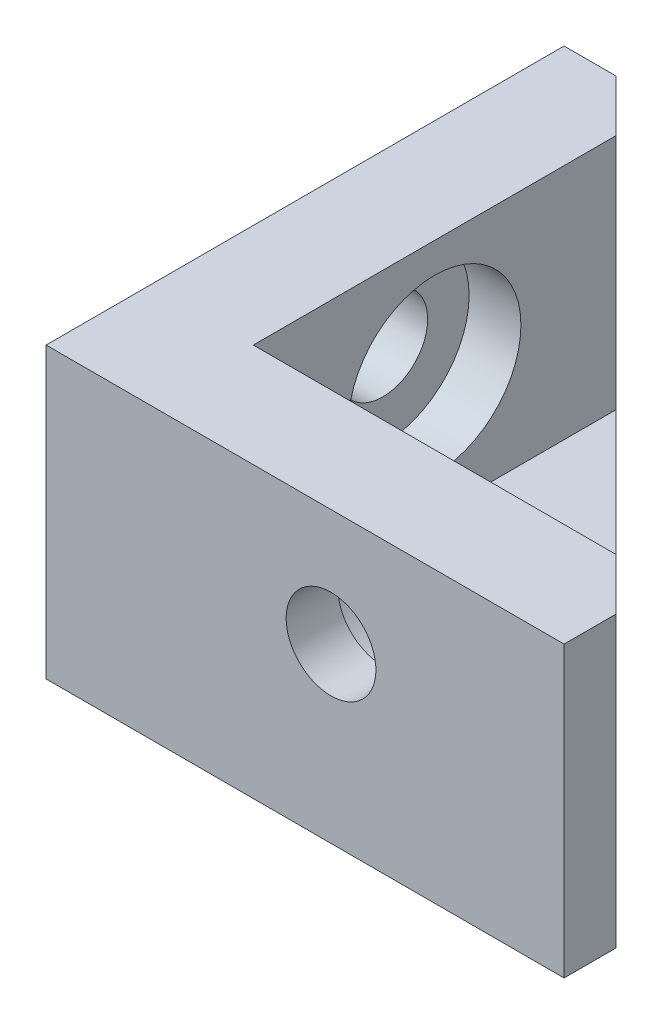
ISO-10303-21;
HEADER;
FILE_DESCRIPTION(('STEP AP214'),'2;1');
FILE_NAME('part.step','',(''),(''),'','','');
FILE_SCHEMA(('AUTOMOTIVE_DESIGN { 1 0 10303 214 1 1 1 1 }'));
ENDSEC;
DATA;
#1=APPLICATION_CONTEXT('core data for automotive mechanical design processes');
#2=APPLICATION_PROTOCOL_DEFINITION('international standard','automotive_design',2000,#1);
#3=PRODUCT_CONTEXT('',#1,'mechanical');
#4=PRODUCT('Part','Part','',(#3));
#5=PRODUCT_RELATED_PRODUCT_CATEGORY('part','',(#4));
#6=PRODUCT_DEFINITION_FORMATION('','',#4);
#7=PRODUCT_DEFINITION_CONTEXT('part definition',#1,'design');
#8=PRODUCT_DEFINITION('design','',#6,#7);
#9=PRODUCT_DEFINITION_SHAPE('','',#8);
#10=(LENGTH_UNIT() NAMED_UNIT(*) SI_UNIT(.MILLI.,.METRE.));
#11=(NAMED_UNIT(*) PLANE_ANGLE_UNIT() SI_UNIT($,.RADIAN.));
#12=(NAMED_UNIT(*) SI_UNIT($,.STERADIAN.) SOLID_ANGLE_UNIT());
#13=UNCERTAINTY_MEASURE_WITH_UNIT(LENGTH_MEASURE(1.E-05),#10,'distance_accuracy_value','');
#14=(GEOMETRIC_REPRESENTATION_CONTEXT(3) GLOBAL_UNCERTAINTY_ASSIGNED_CONTEXT((#13)) GLOBAL_UNIT_ASSIGNED_CONTEXT((#10,
#11,#12)) REPRESENTATION_CONTEXT('',''));
#15=CARTESIAN_POINT('',(0.,0.,0.));
#16=DIRECTION('',(0.,0.,1.));
#17=DIRECTION('',(1.,0.,0.));
#18=AXIS2_PLACEMENT_3D('',#15,#16,#17);
#19=CARTESIAN_POINT('',(0.,0.,-6.));
#20=DIRECTION('',(0.,0.,-1.));
#21=DIRECTION('',(-1.,0.,0.));
#22=AXIS2_PLACEMENT_3D('',#19,#20,#21);
#23=PLANE('',#22);
#24=CARTESIAN_POINT('',(16.5,10.,-6.));
#25=DIRECTION('',(0.,0.,-1.));
#26=DIRECTION('',(-1.,0.,0.));
#27=AXIS2_PLACEMENT_3D('',#24,#25,#26);
#28=CIRCLE('',#27,5.);
#29=CARTESIAN_POINT('',(11.5,10.,-6.));
#30=VERTEX_POINT('',#29);
#31=EDGE_CURVE('E143',#30,#30,#28,.T.);
#32=ORIENTED_EDGE('',*,*,#31,.F.);
#33=EDGE_LOOP('',(#32));
#34=FACE_BOUND('',#33,.T.);
#35=DIRECTION('',(0.,-1.,0.));
#36=VECTOR('',#35,1.);
#37=CARTESIAN_POINT('',(27.,32.,-6.));
#38=LINE('',#37,#36);
#39=CARTESIAN_POINT('',(27.,16.75,-6.));
#40=VERTEX_POINT('',#39);
#41=CARTESIAN_POINT('',(27.,3.,-6.));
#42=VERTEX_POINT('',#41);
#43=EDGE_CURVE('E116',#40,#42,#38,.T.);
#44=ORIENTED_EDGE('',*,*,#43,.T.);
#45=DIRECTION('',(-1.,0.,0.));
#46=VECTOR('',#45,1.);
#47=CARTESIAN_POINT('',(0.,3.,-6.));
#48=LINE('',#47,#46);
#49=CARTESIAN_POINT('',(6.,3.,-6.));
#50=VERTEX_POINT('',#49);
#51=EDGE_CURVE('E102',#42,#50,#48,.T.);
#52=ORIENTED_EDGE('',*,*,#51,.T.);
#53=DIRECTION('',(0.,-1.,0.));
#54=VECTOR('',#53,1.);
#55=CARTESIAN_POINT('',(6.,20.,-6.));
#56=LINE('',#55,#54);
#57=CARTESIAN_POINT('',(6.,16.75,-6.));
#58=VERTEX_POINT('',#57);
#59=EDGE_CURVE('E136',#58,#50,#56,.T.);
#60=ORIENTED_EDGE('',*,*,#59,.F.);
#61=DIRECTION('',(-1.,0.,0.));
#62=VECTOR('',#61,1.);
#63=CARTESIAN_POINT('',(0.,16.75,-6.));
#64=LINE('',#63,#62);
#65=EDGE_CURVE('E62',#40,#58,#64,.T.);
#66=ORIENTED_EDGE('',*,*,#65,.F.);
#67=EDGE_LOOP('',(#44,#52,#60,#66));
#68=FACE_BOUND('',#67,.T.);
#69=ADVANCED_FACE('F39',(#34,#68),#23,.T.);
#70=CARTESIAN_POINT('',(6.,0.,0.));
#71=DIRECTION('',(1.,0.,0.));
#72=DIRECTION('',(0.,0.,-1.));
#73=AXIS2_PLACEMENT_3D('',#70,#71,#72);
#74=PLANE('',#73);
#75=CARTESIAN_POINT('',(6.,10.,-16.5));
#76=DIRECTION('',(1.,0.,0.));
#77=DIRECTION('',(0.,0.,-1.));
#78=AXIS2_PLACEMENT_3D('',#75,#76,#77);
#79=CIRCLE('',#78,5.);
#80=CARTESIAN_POINT('',(6.,10.,-21.5));
#81=VERTEX_POINT('',#80);
#82=EDGE_CURVE('E132',#81,#81,#79,.T.);
#83=ORIENTED_EDGE('',*,*,#82,.F.);
#84=EDGE_LOOP('',(#83));
#85=FACE_BOUND('',#84,.T.);
#86=ORIENTED_EDGE('',*,*,#59,.T.);
#87=DIRECTION('',(0.,0.,-1.));
#88=VECTOR('',#87,1.);
#89=CARTESIAN_POINT('',(6.,3.,0.));
#90=LINE('',#89,#88);
#91=CARTESIAN_POINT('',(6.,3.,-27.));
#92=VERTEX_POINT('',#91);
#93=EDGE_CURVE('E11',#50,#92,#90,.T.);
#94=ORIENTED_EDGE('',*,*,#93,.T.);
#95=DIRECTION('',(0.,-1.,0.));
#96=VECTOR('',#95,1.);
#97=CARTESIAN_POINT('',(6.,32.,-27.));
#98=LINE('',#97,#96);
#99=CARTESIAN_POINT('',(6.,16.75,-27.));
#100=VERTEX_POINT('',#99);
#101=EDGE_CURVE('E119',#100,#92,#98,.T.);
#102=ORIENTED_EDGE('',*,*,#101,.F.);
#103=DIRECTION('',(0.,0.,-1.));
#104=VECTOR('',#103,1.);
#105=CARTESIAN_POINT('',(6.,16.75,0.));
#106=LINE('',#105,#104);
#107=EDGE_CURVE('E48',#58,#100,#106,.T.);
#108=ORIENTED_EDGE('',*,*,#107,.F.);
#109=EDGE_LOOP('',(#86,#94,#102,#108));
#110=FACE_BOUND('',#109,.T.);
#111=ADVANCED_FACE('F207',(#85,#110),#74,.T.);
#112=CARTESIAN_POINT('',(3.,20.,-30.));
#113=DIRECTION('',(-1.,0.,0.));
#114=DIRECTION('',(0.,0.,1.));
#115=AXIS2_PLACEMENT_3D('',#112,#113,#114);
#116=PLANE('',#115);
#117=CARTESIAN_POINT('',(3.,10.,-16.5));
#118=DIRECTION('',(1.,0.,0.));
#119=DIRECTION('',(0.,0.,-1.));
#120=AXIS2_PLACEMENT_3D('',#117,#118,#119);
#121=CIRCLE('',#120,2.6);
#122=CARTESIAN_POINT('',(3.,10.,-19.1));
#123=VERTEX_POINT('',#122);
#124=EDGE_CURVE('E147',#123,#123,#121,.T.);
#125=ORIENTED_EDGE('',*,*,#124,.F.);
#126=EDGE_LOOP('',(#125));
#127=FACE_BOUND('',#126,.T.);
#128=CARTESIAN_POINT('',(3.,10.,-16.5));
#129=DIRECTION('',(1.,0.,0.));
#130=DIRECTION('',(0.,0.,-1.));
#131=AXIS2_PLACEMENT_3D('',#128,#129,#130);
#132=CIRCLE('',#131,5.);
#133=CARTESIAN_POINT('',(3.,10.,-21.5));
#134=VERTEX_POINT('',#133);
#135=EDGE_CURVE('E127',#134,#134,#132,.T.);
#136=ORIENTED_EDGE('',*,*,#135,.T.);
#137=EDGE_LOOP('',(#136));
#138=FACE_BOUND('',#137,.T.);
#139=ADVANCED_FACE('F209',(#127,#138),#116,.F.);
#140=CARTESIAN_POINT('',(3.,20.,-3.));
#141=DIRECTION('',(0.,0.,1.));
#142=DIRECTION('',(1.,0.,0.));
#143=AXIS2_PLACEMENT_3D('',#140,#141,#142);
#144=PLANE('',#143);
#145=CARTESIAN_POINT('',(16.5,10.,-3.));
#146=DIRECTION('',(0.,0.,-1.));
#147=DIRECTION('',(-1.,0.,0.));
#148=AXIS2_PLACEMENT_3D('',#145,#146,#147);
#149=CIRCLE('',#148,2.6);
#150=CARTESIAN_POINT('',(13.9,10.,-3.));
#151=VERTEX_POINT('',#150);
#152=EDGE_CURVE('E155',#151,#151,#149,.T.);
#153=ORIENTED_EDGE('',*,*,#152,.F.);
#154=EDGE_LOOP('',(#153));
#155=FACE_BOUND('',#154,.T.);
#156=CARTESIAN_POINT('',(16.5,10.,-3.));
#157=DIRECTION('',(0.,0.,-1.));
#158=DIRECTION('',(-1.,0.,0.));
#159=AXIS2_PLACEMENT_3D('',#156,#157,#158);
#160=CIRCLE('',#159,5.);
#161=CARTESIAN_POINT('',(11.5,10.,-3.));
#162=VERTEX_POINT('',#161);
#163=EDGE_CURVE('E142',#162,#162,#160,.T.);
#164=ORIENTED_EDGE('',*,*,#163,.T.);
#165=EDGE_LOOP('',(#164));
#166=FACE_BOUND('',#165,.T.);
#167=ADVANCED_FACE('F216',(#155,#166),#144,.F.);
#168=CARTESIAN_POINT('',(0.,20.,0.));
#169=DIRECTION('',(0.,0.,-1.));
#170=DIRECTION('',(-1.,0.,0.));
#171=AXIS2_PLACEMENT_3D('',#168,#169,#170);
#172=PLANE('',#171);
#173=CARTESIAN_POINT('',(16.5,10.,0.));
#174=DIRECTION('',(0.,0.,-1.));
#175=DIRECTION('',(-1.,0.,0.));
#176=AXIS2_PLACEMENT_3D('',#173,#174,#175);
#177=CIRCLE('',#176,2.6);
#178=CARTESIAN_POINT('',(13.9,10.,0.));
#179=VERTEX_POINT('',#178);
#180=EDGE_CURVE('E159',#179,#179,#177,.T.);
#181=ORIENTED_EDGE('',*,*,#180,.T.);
#182=EDGE_LOOP('',(#181));
#183=FACE_BOUND('',#182,.T.);
#184=DIRECTION('',(0.,-1.,0.));
#185=VECTOR('',#184,1.);
#186=CARTESIAN_POINT('',(30.,20.,0.));
#187=LINE('',#186,#185);
#188=CARTESIAN_POINT('',(30.,16.75,0.));
#189=VERTEX_POINT('',#188);
#190=CARTESIAN_POINT('',(30.,0.,0.));
#191=VERTEX_POINT('',#190);
#192=EDGE_CURVE('E195',#189,#191,#187,.T.);
#193=ORIENTED_EDGE('',*,*,#192,.F.);
#194=DIRECTION('',(1.,0.,0.));
#195=VECTOR('',#194,1.);
#196=CARTESIAN_POINT('',(0.,16.75,0.));
#197=LINE('',#196,#195);
#198=CARTESIAN_POINT('',(0.,16.75,0.));
#199=VERTEX_POINT('',#198);
#200=EDGE_CURVE('E266',#199,#189,#197,.T.);
#201=ORIENTED_EDGE('',*,*,#200,.F.);
#202=DIRECTION('',(0.,-1.,0.));
#203=VECTOR('',#202,1.);
#204=CARTESIAN_POINT('',(0.,20.,0.));
#205=LINE('',#204,#203);
#206=CARTESIAN_POINT('',(0.,0.,0.));
#207=VERTEX_POINT('',#206);
#208=EDGE_CURVE('E189',#199,#207,#205,.T.);
#209=ORIENTED_EDGE('',*,*,#208,.T.);
#210=DIRECTION('',(1.,0.,0.));
#211=VECTOR('',#210,1.);
#212=CARTESIAN_POINT('',(0.,0.,0.));
#213=LINE('',#212,#211);
#214=EDGE_CURVE('E171',#207,#191,#213,.T.);
#215=ORIENTED_EDGE('',*,*,#214,.T.);
#216=EDGE_LOOP('',(#193,#201,#209,#215));
#217=FACE_BOUND('',#216,.T.);
#218=ADVANCED_FACE('F41',(#183,#217),#172,.F.);
#219=CARTESIAN_POINT('',(30.,20.,0.));
#220=DIRECTION('',(-1.,0.,0.));
#221=DIRECTION('',(0.,0.,1.));
#222=AXIS2_PLACEMENT_3D('',#219,#220,#221);
#223=PLANE('',#222);
#224=DIRECTION('',(0.,-1.,0.));
#225=VECTOR('',#224,1.);
#226=CARTESIAN_POINT('',(30.,2.,-3.));
#227=LINE('',#226,#225);
#228=CARTESIAN_POINT('',(30.,16.75,-3.));
#229=VERTEX_POINT('',#228);
#230=CARTESIAN_POINT('',(30.,0.,-3.));
#231=VERTEX_POINT('',#230);
#232=EDGE_CURVE('E168',#229,#231,#227,.T.);
#233=ORIENTED_EDGE('',*,*,#232,.F.);
#234=DIRECTION('',(0.,0.,-1.));
#235=VECTOR('',#234,1.);
#236=CARTESIAN_POINT('',(30.,16.75,0.));
#237=LINE('',#236,#235);
#238=EDGE_CURVE('E109',#189,#229,#237,.T.);
#239=ORIENTED_EDGE('',*,*,#238,.F.);
#240=ORIENTED_EDGE('',*,*,#192,.T.);
#241=DIRECTION('',(0.,0.,-1.));
#242=VECTOR('',#241,1.);
#243=CARTESIAN_POINT('',(30.,0.,0.));
#244=LINE('',#243,#242);
#245=EDGE_CURVE('E177',#191,#231,#244,.T.);
#246=ORIENTED_EDGE('',*,*,#245,.T.);
#247=EDGE_LOOP('',(#233,#239,#240,#246));
#248=FACE_BOUND('',#247,.T.);
#249=ADVANCED_FACE('F250',(#248),#223,.F.);
#250=CARTESIAN_POINT('',(0.,20.,-30.));
#251=DIRECTION('',(0.,0.,1.));
#252=DIRECTION('',(1.,0.,0.));
#253=AXIS2_PLACEMENT_3D('',#250,#251,#252);
#254=PLANE('',#253);
#255=DIRECTION('',(0.,-1.,0.));
#256=VECTOR('',#255,1.);
#257=CARTESIAN_POINT('',(0.,20.,-30.));
#258=LINE('',#257,#256);
#259=CARTESIAN_POINT('',(0.,16.75,-30.));
#260=VERTEX_POINT('',#259);
#261=CARTESIAN_POINT('',(0.,0.,-30.));
#262=VERTEX_POINT('',#261);
#263=EDGE_CURVE('E192',#260,#262,#258,.T.);
#264=ORIENTED_EDGE('',*,*,#263,.F.);
#265=DIRECTION('',(1.,0.,0.));
#266=VECTOR('',#265,1.);
#267=CARTESIAN_POINT('',(0.,16.75,-30.));
#268=LINE('',#267,#266);
#269=CARTESIAN_POINT('',(3.,16.75,-30.));
#270=VERTEX_POINT('',#269);
#271=EDGE_CURVE('E274',#260,#270,#268,.T.);
#272=ORIENTED_EDGE('',*,*,#271,.T.);
#273=DIRECTION('',(0.,-1.,0.));
#274=VECTOR('',#273,1.);
#275=CARTESIAN_POINT('',(3.,2.,-30.));
#276=LINE('',#275,#274);
#277=CARTESIAN_POINT('',(3.,0.,-30.));
#278=VERTEX_POINT('',#277);
#279=EDGE_CURVE('E167',#270,#278,#276,.T.);
#280=ORIENTED_EDGE('',*,*,#279,.T.);
#281=DIRECTION('',(-1.,0.,0.));
#282=VECTOR('',#281,1.);
#283=CARTESIAN_POINT('',(0.,0.,-30.));
#284=LINE('',#283,#282);
#285=EDGE_CURVE('E181',#278,#262,#284,.T.);
#286=ORIENTED_EDGE('',*,*,#285,.T.);
#287=EDGE_LOOP('',(#264,#272,#280,#286));
#288=FACE_BOUND('',#287,.T.);
#289=ADVANCED_FACE('F247',(#288),#254,.F.);
#290=CARTESIAN_POINT('',(0.,20.,0.));
#291=DIRECTION('',(1.,0.,0.));
#292=DIRECTION('',(0.,0.,-1.));
#293=AXIS2_PLACEMENT_3D('',#290,#291,#292);
#294=PLANE('',#293);
#295=CARTESIAN_POINT('',(0.,10.,-16.5));
#296=DIRECTION('',(1.,0.,0.));
#297=DIRECTION('',(0.,0.,-1.));
#298=AXIS2_PLACEMENT_3D('',#295,#296,#297);
#299=CIRCLE('',#298,2.6);
#300=CARTESIAN_POINT('',(0.,10.,-19.1));
#301=VERTEX_POINT('',#300);
#302=EDGE_CURVE('E154',#301,#301,#299,.T.);
#303=ORIENTED_EDGE('',*,*,#302,.T.);
#304=EDGE_LOOP('',(#303));
#305=FACE_BOUND('',#304,.T.);
#306=ORIENTED_EDGE('',*,*,#208,.F.);
#307=DIRECTION('',(0.,0.,-1.));
#308=VECTOR('',#307,1.);
#309=CARTESIAN_POINT('',(0.,16.75,0.));
#310=LINE('',#309,#308);
#311=EDGE_CURVE('E268',#199,#260,#310,.T.);
#312=ORIENTED_EDGE('',*,*,#311,.T.);
#313=ORIENTED_EDGE('',*,*,#263,.T.);
#314=DIRECTION('',(0.,0.,1.));
#315=VECTOR('',#314,1.);
#316=CARTESIAN_POINT('',(0.,0.,0.));
#317=LINE('',#316,#315);
#318=EDGE_CURVE('E185',#262,#207,#317,.T.);
#319=ORIENTED_EDGE('',*,*,#318,.T.);
#320=EDGE_LOOP('',(#306,#312,#313,#319));
#321=FACE_BOUND('',#320,.T.);
#322=ADVANCED_FACE('F243',(#305,#321),#294,.F.);
#323=CARTESIAN_POINT('',(0.,0.,0.));
#324=DIRECTION('',(0.,1.,0.));
#325=DIRECTION('',(0.,0.,1.));
#326=AXIS2_PLACEMENT_3D('',#323,#324,#325);
#327=PLANE('',#326);
#328=ORIENTED_EDGE('',*,*,#285,.F.);
#329=DIRECTION('',(0.707106781186548,0.,0.707106781186548));
#330=VECTOR('',#329,1.);
#331=CARTESIAN_POINT('',(3.,0.,-30.));
#332=LINE('',#331,#330);
#333=EDGE_CURVE('E163',#278,#231,#332,.T.);
#334=ORIENTED_EDGE('',*,*,#333,.T.);
#335=ORIENTED_EDGE('',*,*,#245,.F.);
#336=ORIENTED_EDGE('',*,*,#214,.F.);
#337=ORIENTED_EDGE('',*,*,#318,.F.);
#338=EDGE_LOOP('',(#328,#334,#335,#336,#337));
#339=FACE_BOUND('',#338,.T.);
#340=ADVANCED_FACE('F240',(#339),#327,.F.);
#341=CARTESIAN_POINT('',(3.,2.,-30.));
#342=DIRECTION('',(0.707106781186547,0.,-0.707106781186547));
#343=DIRECTION('',(-0.707106781186548,0.,-0.707106781186548));
#344=AXIS2_PLACEMENT_3D('',#341,#342,#343);
#345=PLANE('',#344);
#346=DIRECTION('',(0.707106781186548,0.,0.707106781186548));
#347=VECTOR('',#346,1.);
#348=CARTESIAN_POINT('',(3.,3.,-30.));
#349=LINE('',#348,#347);
#350=EDGE_CURVE('E55',#92,#42,#349,.T.);
#351=ORIENTED_EDGE('',*,*,#350,.T.);
#352=ORIENTED_EDGE('',*,*,#43,.F.);
#353=DIRECTION('',(-0.707106781186548,0.,-0.707106781186548));
#354=VECTOR('',#353,1.);
#355=CARTESIAN_POINT('',(3.,16.75,-30.));
#356=LINE('',#355,#354);
#357=EDGE_CURVE('E123',#229,#40,#356,.T.);
#358=ORIENTED_EDGE('',*,*,#357,.F.);
#359=ORIENTED_EDGE('',*,*,#232,.T.);
#360=ORIENTED_EDGE('',*,*,#333,.F.);
#361=ORIENTED_EDGE('',*,*,#279,.F.);
#362=EDGE_CURVE('E129',#100,#270,#356,.T.);
#363=ORIENTED_EDGE('',*,*,#362,.F.);
#364=ORIENTED_EDGE('',*,*,#101,.T.);
#365=EDGE_LOOP('',(#351,#352,#358,#359,#360,#361,#363,#364));
#366=FACE_BOUND('',#365,.T.);
#367=ADVANCED_FACE('F114',(#366),#345,.T.);
#368=CARTESIAN_POINT('',(16.5,10.,27.));
#369=DIRECTION('',(0.,0.,-1.));
#370=DIRECTION('',(-1.,0.,0.));
#371=AXIS2_PLACEMENT_3D('',#368,#369,#370);
#372=CYLINDRICAL_SURFACE('',#371,2.6);
#373=ORIENTED_EDGE('',*,*,#152,.T.);
#374=EDGE_LOOP('',(#373));
#375=FACE_BOUND('',#374,.T.);
#376=ORIENTED_EDGE('',*,*,#180,.F.);
#377=EDGE_LOOP('',(#376));
#378=FACE_BOUND('',#377,.T.);
#379=ADVANCED_FACE('F233',(#375,#378),#372,.F.);
#380=CARTESIAN_POINT('',(-27.,10.,-16.5));
#381=DIRECTION('',(1.,0.,0.));
#382=DIRECTION('',(0.,0.,-1.));
#383=AXIS2_PLACEMENT_3D('',#380,#381,#382);
#384=CYLINDRICAL_SURFACE('',#383,2.6);
#385=ORIENTED_EDGE('',*,*,#124,.T.);
#386=EDGE_LOOP('',(#385));
#387=FACE_BOUND('',#386,.T.);
#388=ORIENTED_EDGE('',*,*,#302,.F.);
#389=EDGE_LOOP('',(#388));
#390=FACE_BOUND('',#389,.T.);
#391=ADVANCED_FACE('F228',(#387,#390),#384,.F.);
#392=CARTESIAN_POINT('',(16.5,10.,-6.));
#393=DIRECTION('',(0.,0.,1.));
#394=DIRECTION('',(1.,0.,0.));
#395=AXIS2_PLACEMENT_3D('',#392,#393,#394);
#396=CYLINDRICAL_SURFACE('',#395,5.);
#397=ORIENTED_EDGE('',*,*,#31,.T.);
#398=EDGE_LOOP('',(#397));
#399=FACE_BOUND('',#398,.T.);
#400=ORIENTED_EDGE('',*,*,#163,.F.);
#401=EDGE_LOOP('',(#400));
#402=FACE_BOUND('',#401,.T.);
#403=ADVANCED_FACE('F226',(#399,#402),#396,.F.);
#404=CARTESIAN_POINT('',(6.,10.,-16.5));
#405=DIRECTION('',(-1.,0.,0.));
#406=DIRECTION('',(0.,0.,1.));
#407=AXIS2_PLACEMENT_3D('',#404,#405,#406);
#408=CYLINDRICAL_SURFACE('',#407,5.);
#409=ORIENTED_EDGE('',*,*,#82,.T.);
#410=EDGE_LOOP('',(#409));
#411=FACE_BOUND('',#410,.T.);
#412=ORIENTED_EDGE('',*,*,#135,.F.);
#413=EDGE_LOOP('',(#412));
#414=FACE_BOUND('',#413,.T.);
#415=ADVANCED_FACE('F224',(#411,#414),#408,.F.);
#416=CARTESIAN_POINT('',(0.,16.75,0.));
#417=DIRECTION('',(0.,-1.,0.));
#418=DIRECTION('',(0.,0.,-1.));
#419=AXIS2_PLACEMENT_3D('',#416,#417,#418);
#420=PLANE('',#419);
#421=ORIENTED_EDGE('',*,*,#357,.T.);
#422=ORIENTED_EDGE('',*,*,#65,.T.);
#423=ORIENTED_EDGE('',*,*,#107,.T.);
#424=ORIENTED_EDGE('',*,*,#362,.T.);
#425=ORIENTED_EDGE('',*,*,#271,.F.);
#426=ORIENTED_EDGE('',*,*,#311,.F.);
#427=ORIENTED_EDGE('',*,*,#200,.T.);
#428=ORIENTED_EDGE('',*,*,#238,.T.);
#429=EDGE_LOOP('',(#421,#422,#423,#424,#425,#426,#427,#428));
#430=FACE_BOUND('',#429,.T.);
#431=ADVANCED_FACE('F201',(#430),#420,.F.);
#432=CARTESIAN_POINT('',(0.,3.,0.));
#433=DIRECTION('',(0.,-1.,0.));
#434=DIRECTION('',(0.,0.,-1.));
#435=AXIS2_PLACEMENT_3D('',#432,#433,#434);
#436=PLANE('',#435);
#437=ORIENTED_EDGE('',*,*,#51,.F.);
#438=ORIENTED_EDGE('',*,*,#350,.F.);
#439=ORIENTED_EDGE('',*,*,#93,.F.);
#440=EDGE_LOOP('',(#437,#438,#439));
#441=FACE_BOUND('',#440,.T.);
#442=ADVANCED_FACE('F103',(#441),#436,.F.);
#443=CLOSED_SHELL('',(#69,#111,#139,#167,#218,#249,#289,#322,#340,#367,#379,#391,#403,#415,#431,#442));
#444=MANIFOLD_SOLID_BREP('B2',#443);
#445=ADVANCED_BREP_SHAPE_REPRESENTATION('',(#18,#444),#14);
#446=SHAPE_DEFINITION_REPRESENTATION(#9,#445);
ENDSEC;
END-ISO-10303-21;
